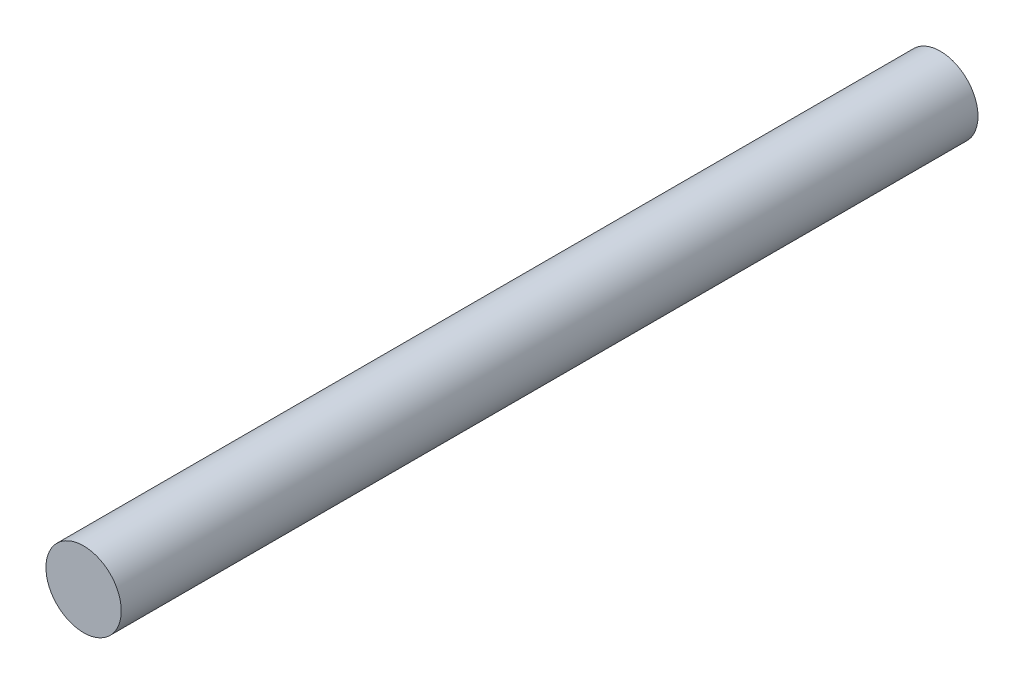
ISO-10303-21;
HEADER;
FILE_DESCRIPTION(('STEP AP214'),'2;1');
FILE_NAME('part.step','',(''),(''),'','','');
FILE_SCHEMA(('AUTOMOTIVE_DESIGN { 1 0 10303 214 1 1 1 1 }'));
ENDSEC;
DATA;
#1=APPLICATION_CONTEXT('core data for automotive mechanical design processes');
#2=APPLICATION_PROTOCOL_DEFINITION('international standard','automotive_design',2000,#1);
#3=PRODUCT_CONTEXT('',#1,'mechanical');
#4=PRODUCT('Part','Part','',(#3));
#5=PRODUCT_RELATED_PRODUCT_CATEGORY('part','',(#4));
#6=PRODUCT_DEFINITION_FORMATION('','',#4);
#7=PRODUCT_DEFINITION_CONTEXT('part definition',#1,'design');
#8=PRODUCT_DEFINITION('design','',#6,#7);
#9=PRODUCT_DEFINITION_SHAPE('','',#8);
#10=(LENGTH_UNIT() NAMED_UNIT(*) SI_UNIT(.MILLI.,.METRE.));
#11=(NAMED_UNIT(*) PLANE_ANGLE_UNIT() SI_UNIT($,.RADIAN.));
#12=(NAMED_UNIT(*) SI_UNIT($,.STERADIAN.) SOLID_ANGLE_UNIT());
#13=UNCERTAINTY_MEASURE_WITH_UNIT(LENGTH_MEASURE(1.E-05),#10,'distance_accuracy_value','');
#14=(GEOMETRIC_REPRESENTATION_CONTEXT(3) GLOBAL_UNCERTAINTY_ASSIGNED_CONTEXT((#13)) GLOBAL_UNIT_ASSIGNED_CONTEXT((#10,
#11,#12)) REPRESENTATION_CONTEXT('',''));
#15=CARTESIAN_POINT('',(0.,0.,0.));
#16=DIRECTION('',(0.,0.,1.));
#17=DIRECTION('',(1.,0.,0.));
#18=AXIS2_PLACEMENT_3D('',#15,#16,#17);
#19=CARTESIAN_POINT('',(0.,0.,18.2));
#20=DIRECTION('',(0.,0.,-1.));
#21=DIRECTION('',(-1.,0.,0.));
#22=AXIS2_PLACEMENT_3D('',#19,#20,#21);
#23=CYLINDRICAL_SURFACE('',#22,0.8);
#24=CARTESIAN_POINT('',(0.,0.,18.2));
#25=DIRECTION('',(0.,0.,1.));
#26=DIRECTION('',(1.,0.,0.));
#27=AXIS2_PLACEMENT_3D('',#24,#25,#26);
#28=CIRCLE('',#27,0.8);
#29=CARTESIAN_POINT('',(0.8,0.,18.2));
#30=VERTEX_POINT('',#29);
#31=EDGE_CURVE('E10',#30,#30,#28,.T.);
#32=ORIENTED_EDGE('',*,*,#31,.F.);
#33=EDGE_LOOP('',(#32));
#34=FACE_BOUND('',#33,.T.);
#35=CARTESIAN_POINT('',(0.,0.,0.));
#36=DIRECTION('',(0.,0.,1.));
#37=DIRECTION('',(1.,0.,0.));
#38=AXIS2_PLACEMENT_3D('',#35,#36,#37);
#39=CIRCLE('',#38,0.8);
#40=CARTESIAN_POINT('',(0.8,0.,0.));
#41=VERTEX_POINT('',#40);
#42=EDGE_CURVE('E34',#41,#41,#39,.T.);
#43=ORIENTED_EDGE('',*,*,#42,.T.);
#44=EDGE_LOOP('',(#43));
#45=FACE_BOUND('',#44,.T.);
#46=ADVANCED_FACE('F31',(#34,#45),#23,.T.);
#47=CARTESIAN_POINT('',(0.,0.,18.2));
#48=DIRECTION('',(0.,0.,1.));
#49=DIRECTION('',(1.,0.,0.));
#50=AXIS2_PLACEMENT_3D('',#47,#48,#49);
#51=PLANE('',#50);
#52=ORIENTED_EDGE('',*,*,#31,.T.);
#53=EDGE_LOOP('',(#52));
#54=FACE_BOUND('',#53,.T.);
#55=ADVANCED_FACE('F46',(#54),#51,.T.);
#56=CARTESIAN_POINT('',(0.,0.,0.));
#57=DIRECTION('',(0.,0.,1.));
#58=DIRECTION('',(1.,0.,0.));
#59=AXIS2_PLACEMENT_3D('',#56,#57,#58);
#60=PLANE('',#59);
#61=ORIENTED_EDGE('',*,*,#42,.F.);
#62=EDGE_LOOP('',(#61));
#63=FACE_BOUND('',#62,.T.);
#64=ADVANCED_FACE('F44',(#63),#60,.F.);
#65=CLOSED_SHELL('',(#46,#55,#64));
#66=MANIFOLD_SOLID_BREP('B2',#65);
#67=ADVANCED_BREP_SHAPE_REPRESENTATION('',(#18,#66),#14);
#68=SHAPE_DEFINITION_REPRESENTATION(#9,#67);
ENDSEC;
END-ISO-10303-21;
